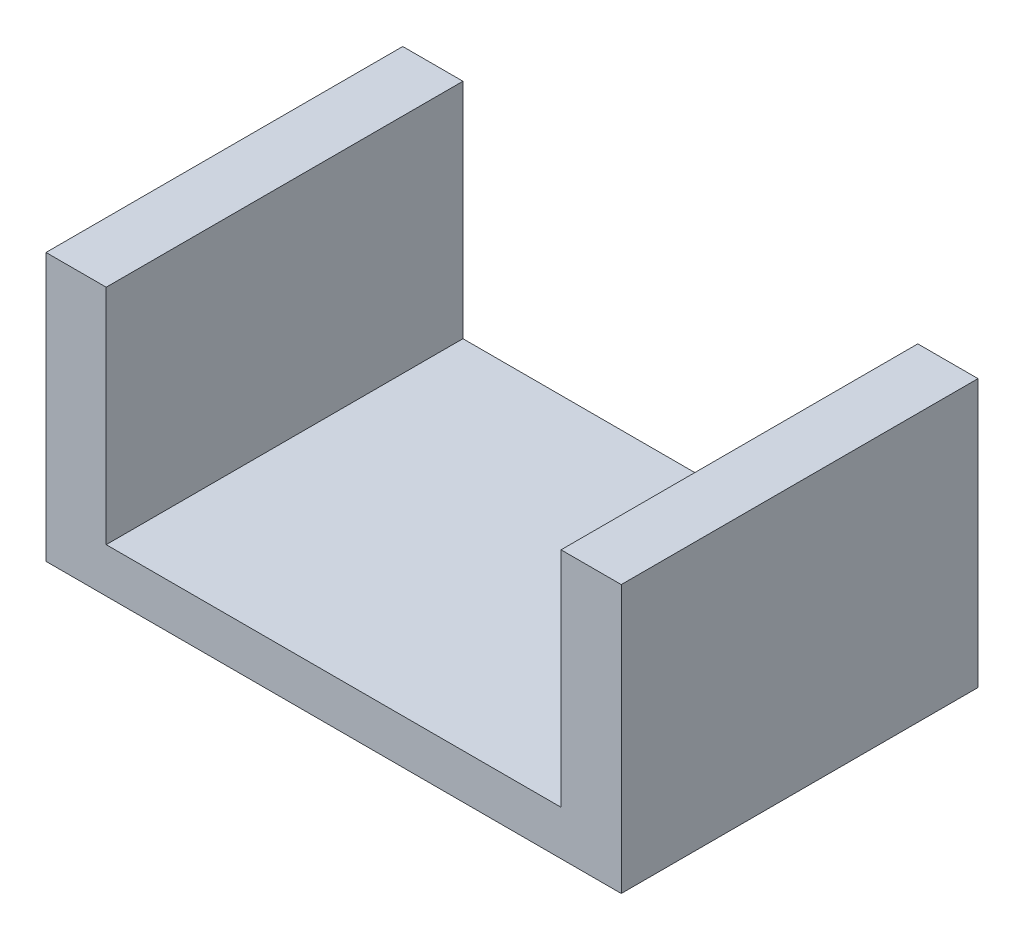
ISO-10303-21;
HEADER;
FILE_DESCRIPTION(('STEP AP214'),'2;1');
FILE_NAME('part.step','',(''),(''),'','','');
FILE_SCHEMA(('AUTOMOTIVE_DESIGN { 1 0 10303 214 1 1 1 1 }'));
ENDSEC;
DATA;
#1=APPLICATION_CONTEXT('core data for automotive mechanical design processes');
#2=APPLICATION_PROTOCOL_DEFINITION('international standard','automotive_design',2000,#1);
#3=PRODUCT_CONTEXT('',#1,'mechanical');
#4=PRODUCT('Part','Part','',(#3));
#5=PRODUCT_RELATED_PRODUCT_CATEGORY('part','',(#4));
#6=PRODUCT_DEFINITION_FORMATION('','',#4);
#7=PRODUCT_DEFINITION_CONTEXT('part definition',#1,'design');
#8=PRODUCT_DEFINITION('design','',#6,#7);
#9=PRODUCT_DEFINITION_SHAPE('','',#8);
#10=(LENGTH_UNIT() NAMED_UNIT(*) SI_UNIT(.MILLI.,.METRE.));
#11=(NAMED_UNIT(*) PLANE_ANGLE_UNIT() SI_UNIT($,.RADIAN.));
#12=(NAMED_UNIT(*) SI_UNIT($,.STERADIAN.) SOLID_ANGLE_UNIT());
#13=UNCERTAINTY_MEASURE_WITH_UNIT(LENGTH_MEASURE(1.E-05),#10,'distance_accuracy_value','');
#14=(GEOMETRIC_REPRESENTATION_CONTEXT(3) GLOBAL_UNCERTAINTY_ASSIGNED_CONTEXT((#13)) GLOBAL_UNIT_ASSIGNED_CONTEXT((#10,
#11,#12)) REPRESENTATION_CONTEXT('',''));
#15=CARTESIAN_POINT('',(0.,0.,0.));
#16=DIRECTION('',(0.,0.,1.));
#17=DIRECTION('',(1.,0.,0.));
#18=AXIS2_PLACEMENT_3D('',#15,#16,#17);
#19=CARTESIAN_POINT('',(-12.9,-15.,5.));
#20=DIRECTION('',(0.,1.,0.));
#21=DIRECTION('',(1.,0.,0.));
#22=AXIS2_PLACEMENT_3D('',#19,#20,#21);
#23=PLANE('',#22);
#24=DIRECTION('',(0.,0.,1.));
#25=VECTOR('',#24,1.);
#26=CARTESIAN_POINT('',(12.9,-15.,5.));
#27=LINE('',#26,#25);
#28=CARTESIAN_POINT('',(12.9,-15.,5.));
#29=VERTEX_POINT('',#28);
#30=CARTESIAN_POINT('',(12.9,-15.,21.));
#31=VERTEX_POINT('',#30);
#32=EDGE_CURVE('E159',#29,#31,#27,.T.);
#33=ORIENTED_EDGE('',*,*,#32,.T.);
#34=DIRECTION('',(-1.,0.,0.));
#35=VECTOR('',#34,1.);
#36=CARTESIAN_POINT('',(12.9,-15.,21.));
#37=LINE('',#36,#35);
#38=CARTESIAN_POINT('',(-12.9,-15.,21.));
#39=VERTEX_POINT('',#38);
#40=EDGE_CURVE('E283',#31,#39,#37,.T.);
#41=ORIENTED_EDGE('',*,*,#40,.T.);
#42=DIRECTION('',(0.,0.,1.));
#43=VECTOR('',#42,1.);
#44=CARTESIAN_POINT('',(-12.9,-15.,5.));
#45=LINE('',#44,#43);
#46=CARTESIAN_POINT('',(-12.9,-15.,5.));
#47=VERTEX_POINT('',#46);
#48=EDGE_CURVE('E271',#47,#39,#45,.T.);
#49=ORIENTED_EDGE('',*,*,#48,.F.);
#50=DIRECTION('',(1.,0.,0.));
#51=VECTOR('',#50,1.);
#52=CARTESIAN_POINT('',(-12.9,-15.,5.));
#53=LINE('',#52,#51);
#54=EDGE_CURVE('E9',#47,#29,#53,.T.);
#55=ORIENTED_EDGE('',*,*,#54,.T.);
#56=EDGE_LOOP('',(#33,#41,#49,#55));
#57=FACE_BOUND('',#56,.T.);
#58=ADVANCED_FACE('F15',(#57),#23,.F.);
#59=CARTESIAN_POINT('',(-12.9,-15.,5.));
#60=DIRECTION('',(0.,0.,1.));
#61=DIRECTION('',(1.,0.,0.));
#62=AXIS2_PLACEMENT_3D('',#59,#60,#61);
#63=PLANE('',#62);
#64=DIRECTION('',(1.,0.,0.));
#65=VECTOR('',#64,1.);
#66=CARTESIAN_POINT('',(-12.9,-3.,5.));
#67=LINE('',#66,#65);
#68=CARTESIAN_POINT('',(-12.9,-3.,5.));
#69=VERTEX_POINT('',#68);
#70=CARTESIAN_POINT('',(-10.2,-3.,5.));
#71=VERTEX_POINT('',#70);
#72=EDGE_CURVE('E24',#69,#71,#67,.T.);
#73=ORIENTED_EDGE('',*,*,#72,.T.);
#74=DIRECTION('',(0.,1.,0.));
#75=VECTOR('',#74,1.);
#76=CARTESIAN_POINT('',(-10.2,-15.,5.));
#77=LINE('',#76,#75);
#78=CARTESIAN_POINT('',(-10.2,-13.,5.));
#79=VERTEX_POINT('',#78);
#80=EDGE_CURVE('E115',#79,#71,#77,.T.);
#81=ORIENTED_EDGE('',*,*,#80,.F.);
#82=DIRECTION('',(1.,0.,0.));
#83=VECTOR('',#82,1.);
#84=CARTESIAN_POINT('',(-12.9,-13.,5.));
#85=LINE('',#84,#83);
#86=CARTESIAN_POINT('',(10.2,-13.,5.));
#87=VERTEX_POINT('',#86);
#88=EDGE_CURVE('E101',#79,#87,#85,.T.);
#89=ORIENTED_EDGE('',*,*,#88,.T.);
#90=DIRECTION('',(0.,1.,0.));
#91=VECTOR('',#90,1.);
#92=CARTESIAN_POINT('',(10.2,-15.,5.));
#93=LINE('',#92,#91);
#94=CARTESIAN_POINT('',(10.2,-3.,5.));
#95=VERTEX_POINT('',#94);
#96=EDGE_CURVE('E149',#87,#95,#93,.T.);
#97=ORIENTED_EDGE('',*,*,#96,.T.);
#98=DIRECTION('',(1.,0.,0.));
#99=VECTOR('',#98,1.);
#100=CARTESIAN_POINT('',(10.2,-3.,5.));
#101=LINE('',#100,#99);
#102=CARTESIAN_POINT('',(12.9,-3.,5.));
#103=VERTEX_POINT('',#102);
#104=EDGE_CURVE('E152',#95,#103,#101,.T.);
#105=ORIENTED_EDGE('',*,*,#104,.T.);
#106=DIRECTION('',(0.,-1.,0.));
#107=VECTOR('',#106,1.);
#108=CARTESIAN_POINT('',(12.9,-3.,5.));
#109=LINE('',#108,#107);
#110=EDGE_CURVE('E43',#103,#29,#109,.T.);
#111=ORIENTED_EDGE('',*,*,#110,.T.);
#112=ORIENTED_EDGE('',*,*,#54,.F.);
#113=DIRECTION('',(0.,-1.,0.));
#114=VECTOR('',#113,1.);
#115=CARTESIAN_POINT('',(-12.9,-3.,5.));
#116=LINE('',#115,#114);
#117=EDGE_CURVE('E268',#69,#47,#116,.T.);
#118=ORIENTED_EDGE('',*,*,#117,.F.);
#119=EDGE_LOOP('',(#73,#81,#89,#97,#105,#111,#112,#118));
#120=FACE_BOUND('',#119,.T.);
#121=ADVANCED_FACE('F17',(#120),#63,.F.);
#122=CARTESIAN_POINT('',(-12.9,-3.,5.));
#123=DIRECTION('',(0.,1.,0.));
#124=DIRECTION('',(1.,0.,0.));
#125=AXIS2_PLACEMENT_3D('',#122,#123,#124);
#126=PLANE('',#125);
#127=ORIENTED_EDGE('',*,*,#72,.F.);
#128=DIRECTION('',(0.,0.,1.));
#129=VECTOR('',#128,1.);
#130=CARTESIAN_POINT('',(-12.9,-3.,5.));
#131=LINE('',#130,#129);
#132=CARTESIAN_POINT('',(-12.9,-3.,21.));
#133=VERTEX_POINT('',#132);
#134=EDGE_CURVE('E265',#69,#133,#131,.T.);
#135=ORIENTED_EDGE('',*,*,#134,.T.);
#136=DIRECTION('',(1.,0.,0.));
#137=VECTOR('',#136,1.);
#138=CARTESIAN_POINT('',(-12.9,-3.,21.));
#139=LINE('',#138,#137);
#140=CARTESIAN_POINT('',(-10.2,-3.,21.));
#141=VERTEX_POINT('',#140);
#142=EDGE_CURVE('E126',#133,#141,#139,.T.);
#143=ORIENTED_EDGE('',*,*,#142,.T.);
#144=DIRECTION('',(0.,0.,1.));
#145=VECTOR('',#144,1.);
#146=CARTESIAN_POINT('',(-10.2,-3.,5.));
#147=LINE('',#146,#145);
#148=EDGE_CURVE('E112',#71,#141,#147,.T.);
#149=ORIENTED_EDGE('',*,*,#148,.F.);
#150=EDGE_LOOP('',(#127,#135,#143,#149));
#151=FACE_BOUND('',#150,.T.);
#152=ADVANCED_FACE('F226',(#151),#126,.T.);
#153=CARTESIAN_POINT('',(12.9,-15.,5.));
#154=DIRECTION('',(1.,0.,0.));
#155=DIRECTION('',(0.,1.,0.));
#156=AXIS2_PLACEMENT_3D('',#153,#154,#155);
#157=PLANE('',#156);
#158=ORIENTED_EDGE('',*,*,#32,.F.);
#159=ORIENTED_EDGE('',*,*,#110,.F.);
#160=DIRECTION('',(0.,0.,1.));
#161=VECTOR('',#160,1.);
#162=CARTESIAN_POINT('',(12.9,-3.,5.));
#163=LINE('',#162,#161);
#164=CARTESIAN_POINT('',(12.9,-3.,21.));
#165=VERTEX_POINT('',#164);
#166=EDGE_CURVE('E156',#103,#165,#163,.T.);
#167=ORIENTED_EDGE('',*,*,#166,.T.);
#168=DIRECTION('',(0.,1.,0.));
#169=VECTOR('',#168,1.);
#170=CARTESIAN_POINT('',(12.9,-15.,21.));
#171=LINE('',#170,#169);
#172=EDGE_CURVE('E286',#31,#165,#171,.T.);
#173=ORIENTED_EDGE('',*,*,#172,.F.);
#174=EDGE_LOOP('',(#158,#159,#167,#173));
#175=FACE_BOUND('',#174,.T.);
#176=ADVANCED_FACE('F203',(#175),#157,.T.);
#177=CARTESIAN_POINT('',(10.2,-3.,5.));
#178=DIRECTION('',(0.,1.,0.));
#179=DIRECTION('',(1.,0.,0.));
#180=AXIS2_PLACEMENT_3D('',#177,#178,#179);
#181=PLANE('',#180);
#182=ORIENTED_EDGE('',*,*,#104,.F.);
#183=DIRECTION('',(0.,0.,1.));
#184=VECTOR('',#183,1.);
#185=CARTESIAN_POINT('',(10.2,-3.,5.));
#186=LINE('',#185,#184);
#187=CARTESIAN_POINT('',(10.2,-3.,21.));
#188=VERTEX_POINT('',#187);
#189=EDGE_CURVE('E146',#95,#188,#186,.T.);
#190=ORIENTED_EDGE('',*,*,#189,.T.);
#191=DIRECTION('',(1.,0.,0.));
#192=VECTOR('',#191,1.);
#193=CARTESIAN_POINT('',(10.2,-3.,21.));
#194=LINE('',#193,#192);
#195=EDGE_CURVE('E136',#188,#165,#194,.T.);
#196=ORIENTED_EDGE('',*,*,#195,.T.);
#197=ORIENTED_EDGE('',*,*,#166,.F.);
#198=EDGE_LOOP('',(#182,#190,#196,#197));
#199=FACE_BOUND('',#198,.T.);
#200=ADVANCED_FACE('F197',(#199),#181,.T.);
#201=CARTESIAN_POINT('',(10.2,-15.,5.));
#202=DIRECTION('',(1.,0.,0.));
#203=DIRECTION('',(0.,1.,0.));
#204=AXIS2_PLACEMENT_3D('',#201,#202,#203);
#205=PLANE('',#204);
#206=ORIENTED_EDGE('',*,*,#189,.F.);
#207=ORIENTED_EDGE('',*,*,#96,.F.);
#208=DIRECTION('',(0.,0.,-1.));
#209=VECTOR('',#208,1.);
#210=CARTESIAN_POINT('',(10.2,-13.,5.));
#211=LINE('',#210,#209);
#212=CARTESIAN_POINT('',(10.2,-13.,21.));
#213=VERTEX_POINT('',#212);
#214=EDGE_CURVE('E108',#213,#87,#211,.T.);
#215=ORIENTED_EDGE('',*,*,#214,.F.);
#216=DIRECTION('',(0.,1.,0.));
#217=VECTOR('',#216,1.);
#218=CARTESIAN_POINT('',(10.2,-15.,21.));
#219=LINE('',#218,#217);
#220=EDGE_CURVE('E138',#213,#188,#219,.T.);
#221=ORIENTED_EDGE('',*,*,#220,.T.);
#222=EDGE_LOOP('',(#206,#207,#215,#221));
#223=FACE_BOUND('',#222,.T.);
#224=ADVANCED_FACE('F202',(#223),#205,.F.);
#225=CARTESIAN_POINT('',(-12.9,-13.,5.));
#226=DIRECTION('',(0.,1.,0.));
#227=DIRECTION('',(1.,0.,0.));
#228=AXIS2_PLACEMENT_3D('',#225,#226,#227);
#229=PLANE('',#228);
#230=ORIENTED_EDGE('',*,*,#88,.F.);
#231=DIRECTION('',(0.,0.,-1.));
#232=VECTOR('',#231,1.);
#233=CARTESIAN_POINT('',(-10.2,-13.,5.));
#234=LINE('',#233,#232);
#235=CARTESIAN_POINT('',(-10.2,-13.,21.));
#236=VERTEX_POINT('',#235);
#237=EDGE_CURVE('E106',#236,#79,#234,.T.);
#238=ORIENTED_EDGE('',*,*,#237,.F.);
#239=DIRECTION('',(1.,0.,0.));
#240=VECTOR('',#239,1.);
#241=CARTESIAN_POINT('',(-12.9,-13.,21.));
#242=LINE('',#241,#240);
#243=EDGE_CURVE('E141',#236,#213,#242,.T.);
#244=ORIENTED_EDGE('',*,*,#243,.T.);
#245=ORIENTED_EDGE('',*,*,#214,.T.);
#246=EDGE_LOOP('',(#230,#238,#244,#245));
#247=FACE_BOUND('',#246,.T.);
#248=ADVANCED_FACE('F103',(#247),#229,.T.);
#249=CARTESIAN_POINT('',(-10.2,-15.,5.));
#250=DIRECTION('',(1.,0.,0.));
#251=DIRECTION('',(0.,1.,0.));
#252=AXIS2_PLACEMENT_3D('',#249,#250,#251);
#253=PLANE('',#252);
#254=DIRECTION('',(0.,1.,0.));
#255=VECTOR('',#254,1.);
#256=CARTESIAN_POINT('',(-10.2,-15.,21.));
#257=LINE('',#256,#255);
#258=EDGE_CURVE('E123',#236,#141,#257,.T.);
#259=ORIENTED_EDGE('',*,*,#258,.F.);
#260=ORIENTED_EDGE('',*,*,#237,.T.);
#261=ORIENTED_EDGE('',*,*,#80,.T.);
#262=ORIENTED_EDGE('',*,*,#148,.T.);
#263=EDGE_LOOP('',(#259,#260,#261,#262));
#264=FACE_BOUND('',#263,.T.);
#265=ADVANCED_FACE('F121',(#264),#253,.T.);
#266=CARTESIAN_POINT('',(-12.9,-15.,21.));
#267=DIRECTION('',(0.,0.,1.));
#268=DIRECTION('',(1.,0.,0.));
#269=AXIS2_PLACEMENT_3D('',#266,#267,#268);
#270=PLANE('',#269);
#271=DIRECTION('',(0.,1.,0.));
#272=VECTOR('',#271,1.);
#273=CARTESIAN_POINT('',(-12.9,-15.,21.));
#274=LINE('',#273,#272);
#275=EDGE_CURVE('E274',#39,#133,#274,.T.);
#276=ORIENTED_EDGE('',*,*,#275,.F.);
#277=ORIENTED_EDGE('',*,*,#40,.F.);
#278=ORIENTED_EDGE('',*,*,#172,.T.);
#279=ORIENTED_EDGE('',*,*,#195,.F.);
#280=ORIENTED_EDGE('',*,*,#220,.F.);
#281=ORIENTED_EDGE('',*,*,#243,.F.);
#282=ORIENTED_EDGE('',*,*,#258,.T.);
#283=ORIENTED_EDGE('',*,*,#142,.F.);
#284=EDGE_LOOP('',(#276,#277,#278,#279,#280,#281,#282,#283));
#285=FACE_BOUND('',#284,.T.);
#286=ADVANCED_FACE('F175',(#285),#270,.T.);
#287=CARTESIAN_POINT('',(-12.9,-15.,5.));
#288=DIRECTION('',(1.,0.,0.));
#289=DIRECTION('',(0.,1.,0.));
#290=AXIS2_PLACEMENT_3D('',#287,#288,#289);
#291=PLANE('',#290);
#292=ORIENTED_EDGE('',*,*,#275,.T.);
#293=ORIENTED_EDGE('',*,*,#134,.F.);
#294=ORIENTED_EDGE('',*,*,#117,.T.);
#295=ORIENTED_EDGE('',*,*,#48,.T.);
#296=EDGE_LOOP('',(#292,#293,#294,#295));
#297=FACE_BOUND('',#296,.T.);
#298=ADVANCED_FACE('F170',(#297),#291,.F.);
#299=CLOSED_SHELL('',(#58,#121,#152,#176,#200,#224,#248,#265,#286,#298));
#300=MANIFOLD_SOLID_BREP('B1',#299);
#301=ADVANCED_BREP_SHAPE_REPRESENTATION('',(#18,#300),#14);
#302=SHAPE_DEFINITION_REPRESENTATION(#9,#301);
ENDSEC;
END-ISO-10303-21;
